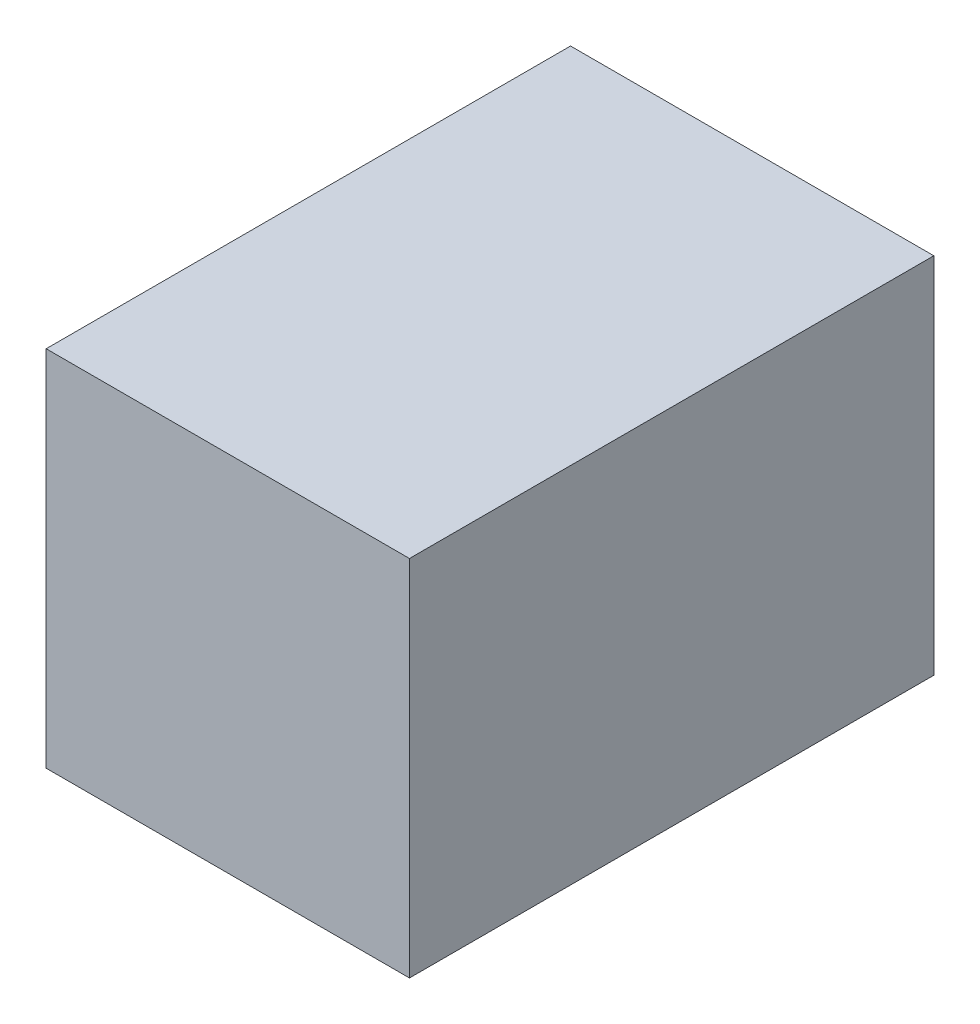
ISO-10303-21;
HEADER;
FILE_DESCRIPTION(('STEP AP214'),'2;1');
FILE_NAME('part.step','',(''),(''),'','','');
FILE_SCHEMA(('AUTOMOTIVE_DESIGN { 1 0 10303 214 1 1 1 1 }'));
ENDSEC;
DATA;
#1=APPLICATION_CONTEXT('core data for automotive mechanical design processes');
#2=APPLICATION_PROTOCOL_DEFINITION('international standard','automotive_design',2000,#1);
#3=PRODUCT_CONTEXT('',#1,'mechanical');
#4=PRODUCT('Part','Part','',(#3));
#5=PRODUCT_RELATED_PRODUCT_CATEGORY('part','',(#4));
#6=PRODUCT_DEFINITION_FORMATION('','',#4);
#7=PRODUCT_DEFINITION_CONTEXT('part definition',#1,'design');
#8=PRODUCT_DEFINITION('design','',#6,#7);
#9=PRODUCT_DEFINITION_SHAPE('','',#8);
#10=(LENGTH_UNIT() NAMED_UNIT(*) SI_UNIT(.MILLI.,.METRE.));
#11=(NAMED_UNIT(*) PLANE_ANGLE_UNIT() SI_UNIT($,.RADIAN.));
#12=(NAMED_UNIT(*) SI_UNIT($,.STERADIAN.) SOLID_ANGLE_UNIT());
#13=UNCERTAINTY_MEASURE_WITH_UNIT(LENGTH_MEASURE(1.E-05),#10,'distance_accuracy_value','');
#14=(GEOMETRIC_REPRESENTATION_CONTEXT(3) GLOBAL_UNCERTAINTY_ASSIGNED_CONTEXT((#13)) GLOBAL_UNIT_ASSIGNED_CONTEXT((#10,
#11,#12)) REPRESENTATION_CONTEXT('',''));
#15=CARTESIAN_POINT('',(0.,0.,0.));
#16=DIRECTION('',(0.,0.,1.));
#17=DIRECTION('',(1.,0.,0.));
#18=AXIS2_PLACEMENT_3D('',#15,#16,#17);
#19=CARTESIAN_POINT('',(-3.3015,-3.3015,9.53));
#20=DIRECTION('',(1.,0.,0.));
#21=DIRECTION('',(0.,0.,-1.));
#22=AXIS2_PLACEMENT_3D('',#19,#20,#21);
#23=PLANE('',#22);
#24=DIRECTION('',(0.,-1.,0.));
#25=VECTOR('',#24,1.);
#26=CARTESIAN_POINT('',(-3.3015,-3.3015,0.));
#27=LINE('',#26,#25);
#28=CARTESIAN_POINT('',(-3.3015,3.3016,0.));
#29=VERTEX_POINT('',#28);
#30=CARTESIAN_POINT('',(-3.3015,-3.3015,0.));
#31=VERTEX_POINT('',#30);
#32=EDGE_CURVE('E96',#29,#31,#27,.T.);
#33=ORIENTED_EDGE('',*,*,#32,.T.);
#34=DIRECTION('',(0.,0.,-1.));
#35=VECTOR('',#34,1.);
#36=CARTESIAN_POINT('',(-3.3015,-3.3015,9.53));
#37=LINE('',#36,#35);
#38=CARTESIAN_POINT('',(-3.3015,-3.3015,9.53));
#39=VERTEX_POINT('',#38);
#40=EDGE_CURVE('E11',#39,#31,#37,.T.);
#41=ORIENTED_EDGE('',*,*,#40,.F.);
#42=DIRECTION('',(0.,-1.,0.));
#43=VECTOR('',#42,1.);
#44=CARTESIAN_POINT('',(-3.3015,-3.3015,9.53));
#45=LINE('',#44,#43);
#46=CARTESIAN_POINT('',(-3.3015,3.3016,9.53));
#47=VERTEX_POINT('',#46);
#48=EDGE_CURVE('E84',#47,#39,#45,.T.);
#49=ORIENTED_EDGE('',*,*,#48,.F.);
#50=DIRECTION('',(0.,0.,-1.));
#51=VECTOR('',#50,1.);
#52=CARTESIAN_POINT('',(-3.3015,3.3016,9.53));
#53=LINE('',#52,#51);
#54=EDGE_CURVE('E92',#47,#29,#53,.T.);
#55=ORIENTED_EDGE('',*,*,#54,.T.);
#56=EDGE_LOOP('',(#33,#41,#49,#55));
#57=FACE_BOUND('',#56,.T.);
#58=ADVANCED_FACE('F33',(#57),#23,.F.);
#59=CARTESIAN_POINT('',(3.3015,-3.3015,9.53));
#60=DIRECTION('',(0.,1.,0.));
#61=DIRECTION('',(0.,0.,1.));
#62=AXIS2_PLACEMENT_3D('',#59,#60,#61);
#63=PLANE('',#62);
#64=DIRECTION('',(1.,0.,0.));
#65=VECTOR('',#64,1.);
#66=CARTESIAN_POINT('',(3.3015,-3.3015,0.));
#67=LINE('',#66,#65);
#68=CARTESIAN_POINT('',(3.3015,-3.3015,0.));
#69=VERTEX_POINT('',#68);
#70=EDGE_CURVE('E88',#31,#69,#67,.T.);
#71=ORIENTED_EDGE('',*,*,#70,.T.);
#72=DIRECTION('',(0.,0.,-1.));
#73=VECTOR('',#72,1.);
#74=CARTESIAN_POINT('',(3.3015,-3.3015,9.53));
#75=LINE('',#74,#73);
#76=CARTESIAN_POINT('',(3.3015,-3.3015,9.53));
#77=VERTEX_POINT('',#76);
#78=EDGE_CURVE('E41',#77,#69,#75,.T.);
#79=ORIENTED_EDGE('',*,*,#78,.F.);
#80=DIRECTION('',(1.,0.,0.));
#81=VECTOR('',#80,1.);
#82=CARTESIAN_POINT('',(3.3015,-3.3015,9.53));
#83=LINE('',#82,#81);
#84=EDGE_CURVE('E79',#39,#77,#83,.T.);
#85=ORIENTED_EDGE('',*,*,#84,.F.);
#86=ORIENTED_EDGE('',*,*,#40,.T.);
#87=EDGE_LOOP('',(#71,#79,#85,#86));
#88=FACE_BOUND('',#87,.T.);
#89=ADVANCED_FACE('F87',(#88),#63,.F.);
#90=CARTESIAN_POINT('',(3.3015,3.3016,9.53));
#91=DIRECTION('',(-1.,0.,0.));
#92=DIRECTION('',(0.,0.,1.));
#93=AXIS2_PLACEMENT_3D('',#90,#91,#92);
#94=PLANE('',#93);
#95=DIRECTION('',(0.,1.,0.));
#96=VECTOR('',#95,1.);
#97=CARTESIAN_POINT('',(3.3015,3.3016,0.));
#98=LINE('',#97,#96);
#99=CARTESIAN_POINT('',(3.3015,3.3016,0.));
#100=VERTEX_POINT('',#99);
#101=EDGE_CURVE('E66',#69,#100,#98,.T.);
#102=ORIENTED_EDGE('',*,*,#101,.T.);
#103=DIRECTION('',(0.,0.,-1.));
#104=VECTOR('',#103,1.);
#105=CARTESIAN_POINT('',(3.3015,3.3016,9.53));
#106=LINE('',#105,#104);
#107=CARTESIAN_POINT('',(3.3015,3.3016,9.53));
#108=VERTEX_POINT('',#107);
#109=EDGE_CURVE('E89',#108,#100,#106,.T.);
#110=ORIENTED_EDGE('',*,*,#109,.F.);
#111=DIRECTION('',(0.,1.,0.));
#112=VECTOR('',#111,1.);
#113=CARTESIAN_POINT('',(3.3015,3.3016,9.53));
#114=LINE('',#113,#112);
#115=EDGE_CURVE('E82',#77,#108,#114,.T.);
#116=ORIENTED_EDGE('',*,*,#115,.F.);
#117=ORIENTED_EDGE('',*,*,#78,.T.);
#118=EDGE_LOOP('',(#102,#110,#116,#117));
#119=FACE_BOUND('',#118,.T.);
#120=ADVANCED_FACE('F90',(#119),#94,.F.);
#121=CARTESIAN_POINT('',(-3.3015,3.3016,9.53));
#122=DIRECTION('',(0.,-1.,0.));
#123=DIRECTION('',(0.,0.,-1.));
#124=AXIS2_PLACEMENT_3D('',#121,#122,#123);
#125=PLANE('',#124);
#126=DIRECTION('',(-1.,0.,0.));
#127=VECTOR('',#126,1.);
#128=CARTESIAN_POINT('',(-3.3015,3.3016,0.));
#129=LINE('',#128,#127);
#130=EDGE_CURVE('E72',#100,#29,#129,.T.);
#131=ORIENTED_EDGE('',*,*,#130,.T.);
#132=ORIENTED_EDGE('',*,*,#54,.F.);
#133=DIRECTION('',(-1.,0.,0.));
#134=VECTOR('',#133,1.);
#135=CARTESIAN_POINT('',(-3.3015,3.3016,9.53));
#136=LINE('',#135,#134);
#137=EDGE_CURVE('E49',#108,#47,#136,.T.);
#138=ORIENTED_EDGE('',*,*,#137,.F.);
#139=ORIENTED_EDGE('',*,*,#109,.T.);
#140=EDGE_LOOP('',(#131,#132,#138,#139));
#141=FACE_BOUND('',#140,.T.);
#142=ADVANCED_FACE('F103',(#141),#125,.F.);
#143=CARTESIAN_POINT('',(0.,0.,9.53));
#144=DIRECTION('',(0.,0.,-1.));
#145=DIRECTION('',(-1.,0.,0.));
#146=AXIS2_PLACEMENT_3D('',#143,#144,#145);
#147=PLANE('',#146);
#148=ORIENTED_EDGE('',*,*,#48,.T.);
#149=ORIENTED_EDGE('',*,*,#84,.T.);
#150=ORIENTED_EDGE('',*,*,#115,.T.);
#151=ORIENTED_EDGE('',*,*,#137,.T.);
#152=EDGE_LOOP('',(#148,#149,#150,#151));
#153=FACE_BOUND('',#152,.T.);
#154=ADVANCED_FACE('F80',(#153),#147,.F.);
#155=CARTESIAN_POINT('',(0.,0.,0.));
#156=DIRECTION('',(0.,0.,-1.));
#157=DIRECTION('',(-1.,0.,0.));
#158=AXIS2_PLACEMENT_3D('',#155,#156,#157);
#159=PLANE('',#158);
#160=ORIENTED_EDGE('',*,*,#32,.F.);
#161=ORIENTED_EDGE('',*,*,#130,.F.);
#162=ORIENTED_EDGE('',*,*,#101,.F.);
#163=ORIENTED_EDGE('',*,*,#70,.F.);
#164=EDGE_LOOP('',(#160,#161,#162,#163));
#165=FACE_BOUND('',#164,.T.);
#166=ADVANCED_FACE('F106',(#165),#159,.T.);
#167=CLOSED_SHELL('',(#58,#89,#120,#142,#154,#166));
#168=MANIFOLD_SOLID_BREP('B2',#167);
#169=ADVANCED_BREP_SHAPE_REPRESENTATION('',(#18,#168),#14);
#170=SHAPE_DEFINITION_REPRESENTATION(#9,#169);
ENDSEC;
END-ISO-10303-21;
